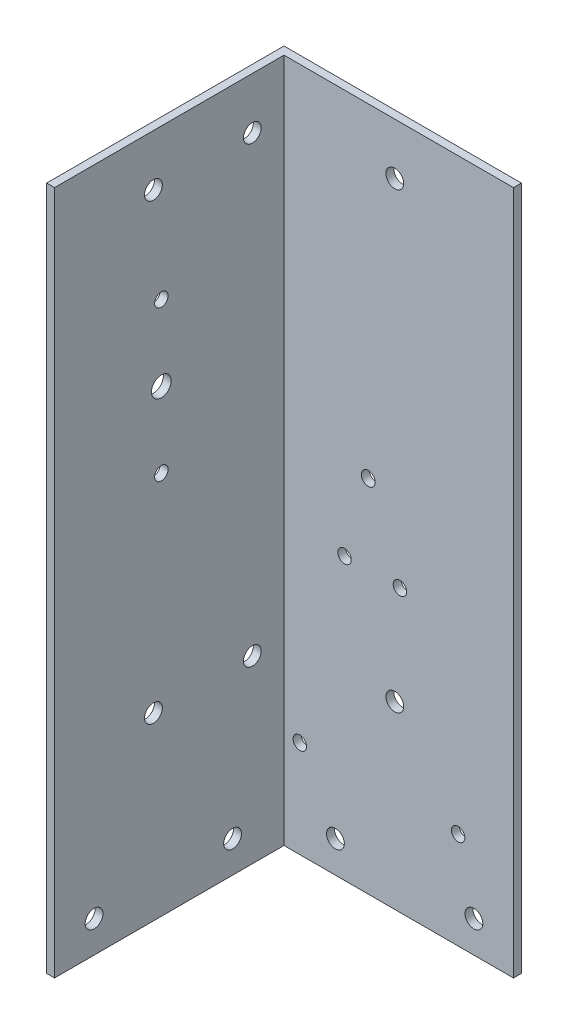
ISO-10303-21;
HEADER;
FILE_DESCRIPTION(('STEP AP214'),'2;1');
FILE_NAME('part.step','',(''),(''),'','','');
FILE_SCHEMA(('AUTOMOTIVE_DESIGN { 1 0 10303 214 1 1 1 1 }'));
ENDSEC;
DATA;
#1=APPLICATION_CONTEXT('core data for automotive mechanical design processes');
#2=APPLICATION_PROTOCOL_DEFINITION('international standard','automotive_design',2000,#1);
#3=PRODUCT_CONTEXT('',#1,'mechanical');
#4=PRODUCT('Part','Part','',(#3));
#5=PRODUCT_RELATED_PRODUCT_CATEGORY('part','',(#4));
#6=PRODUCT_DEFINITION_FORMATION('','',#4);
#7=PRODUCT_DEFINITION_CONTEXT('part definition',#1,'design');
#8=PRODUCT_DEFINITION('design','',#6,#7);
#9=PRODUCT_DEFINITION_SHAPE('','',#8);
#10=(LENGTH_UNIT() NAMED_UNIT(*) SI_UNIT(.MILLI.,.METRE.));
#11=(NAMED_UNIT(*) PLANE_ANGLE_UNIT() SI_UNIT($,.RADIAN.));
#12=(NAMED_UNIT(*) SI_UNIT($,.STERADIAN.) SOLID_ANGLE_UNIT());
#13=UNCERTAINTY_MEASURE_WITH_UNIT(LENGTH_MEASURE(1.E-05),#10,'distance_accuracy_value','');
#14=(GEOMETRIC_REPRESENTATION_CONTEXT(3) GLOBAL_UNCERTAINTY_ASSIGNED_CONTEXT((#13)) GLOBAL_UNIT_ASSIGNED_CONTEXT((#10,
#11,#12)) REPRESENTATION_CONTEXT('',''));
#15=CARTESIAN_POINT('',(0.,0.,0.));
#16=DIRECTION('',(0.,0.,1.));
#17=DIRECTION('',(1.,0.,0.));
#18=AXIS2_PLACEMENT_3D('',#15,#16,#17);
#19=CARTESIAN_POINT('',(0.,173.,1.99999999999997));
#20=DIRECTION('',(0.,0.,-1.));
#21=DIRECTION('',(-1.,0.,0.));
#22=AXIS2_PLACEMENT_3D('',#19,#20,#21);
#23=PLANE('',#22);
#24=CARTESIAN_POINT('',(23.2999996870757,91.0000000000002,1.99999999999989));
#25=DIRECTION('',(0.,0.,-1.));
#26=DIRECTION('',(-1.,0.,0.));
#27=AXIS2_PLACEMENT_3D('',#24,#25,#26);
#28=CIRCLE('',#27,1.75);
#29=CARTESIAN_POINT('',(21.5499996870757,91.0000000000002,1.99999999999989));
#30=VERTEX_POINT('',#29);
#31=EDGE_CURVE('E190',#30,#30,#28,.T.);
#32=ORIENTED_EDGE('',*,*,#31,.T.);
#33=EDGE_LOOP('',(#32));
#34=FACE_BOUND('',#33,.T.);
#35=CARTESIAN_POINT('',(46.,24.5,1.9999999999999));
#36=DIRECTION('',(0.,0.,-1.));
#37=DIRECTION('',(-1.,0.,0.));
#38=AXIS2_PLACEMENT_3D('',#35,#36,#37);
#39=CIRCLE('',#38,1.69999999999999);
#40=CARTESIAN_POINT('',(44.3,24.5,1.9999999999999));
#41=VERTEX_POINT('',#40);
#42=EDGE_CURVE('E194',#41,#41,#39,.T.);
#43=ORIENTED_EDGE('',*,*,#42,.T.);
#44=EDGE_LOOP('',(#43));
#45=FACE_BOUND('',#44,.T.);
#46=CARTESIAN_POINT('',(5.99999999999999,24.5,2.));
#47=DIRECTION('',(0.,0.,-1.));
#48=DIRECTION('',(-1.,0.,0.));
#49=AXIS2_PLACEMENT_3D('',#46,#47,#48);
#50=CIRCLE('',#49,1.69999999999999);
#51=CARTESIAN_POINT('',(4.3,24.5,2.));
#52=VERTEX_POINT('',#51);
#53=EDGE_CURVE('E198',#52,#52,#50,.T.);
#54=ORIENTED_EDGE('',*,*,#53,.T.);
#55=EDGE_LOOP('',(#54));
#56=FACE_BOUND('',#55,.T.);
#57=CARTESIAN_POINT('',(31.2999996870757,71.0000000000002,1.9999999999999));
#58=DIRECTION('',(0.,0.,-1.));
#59=DIRECTION('',(-1.,0.,0.));
#60=AXIS2_PLACEMENT_3D('',#57,#58,#59);
#61=CIRCLE('',#60,1.7);
#62=CARTESIAN_POINT('',(29.5999996870757,71.0000000000002,1.9999999999999));
#63=VERTEX_POINT('',#62);
#64=EDGE_CURVE('E202',#63,#63,#61,.T.);
#65=ORIENTED_EDGE('',*,*,#64,.T.);
#66=EDGE_LOOP('',(#65));
#67=FACE_BOUND('',#66,.T.);
#68=CARTESIAN_POINT('',(17.2999996870757,71.0000000000002,2.));
#69=DIRECTION('',(0.,0.,-1.));
#70=DIRECTION('',(-1.,0.,0.));
#71=AXIS2_PLACEMENT_3D('',#68,#69,#70);
#72=CIRCLE('',#71,1.7);
#73=CARTESIAN_POINT('',(15.5999996870757,71.0000000000002,2.));
#74=VERTEX_POINT('',#73);
#75=EDGE_CURVE('E206',#74,#74,#72,.T.);
#76=ORIENTED_EDGE('',*,*,#75,.T.);
#77=EDGE_LOOP('',(#76));
#78=FACE_BOUND('',#77,.T.);
#79=CARTESIAN_POINT('',(29.9999999999999,45.5,1.9999999999999));
#80=DIRECTION('',(0.,0.,-1.));
#81=DIRECTION('',(-1.,0.,0.));
#82=AXIS2_PLACEMENT_3D('',#79,#80,#81);
#83=CIRCLE('',#82,2.25);
#84=CARTESIAN_POINT('',(27.7499999999999,45.5,1.9999999999999));
#85=VERTEX_POINT('',#84);
#86=EDGE_CURVE('E210',#85,#85,#83,.T.);
#87=ORIENTED_EDGE('',*,*,#86,.T.);
#88=EDGE_LOOP('',(#87));
#89=FACE_BOUND('',#88,.T.);
#90=CARTESIAN_POINT('',(50.,8.00000000000002,1.9999999999999));
#91=DIRECTION('',(0.,0.,-1.));
#92=DIRECTION('',(-1.,0.,0.));
#93=AXIS2_PLACEMENT_3D('',#90,#91,#92);
#94=CIRCLE('',#93,2.25);
#95=CARTESIAN_POINT('',(47.75,8.00000000000002,1.9999999999999));
#96=VERTEX_POINT('',#95);
#97=EDGE_CURVE('E214',#96,#96,#94,.T.);
#98=ORIENTED_EDGE('',*,*,#97,.T.);
#99=EDGE_LOOP('',(#98));
#100=FACE_BOUND('',#99,.T.);
#101=CARTESIAN_POINT('',(15.,8.00000000000003,1.99999999999997));
#102=DIRECTION('',(0.,0.,-1.));
#103=DIRECTION('',(-1.,0.,0.));
#104=AXIS2_PLACEMENT_3D('',#101,#102,#103);
#105=CIRCLE('',#104,2.24999999999999);
#106=CARTESIAN_POINT('',(12.75,8.00000000000003,1.99999999999997));
#107=VERTEX_POINT('',#106);
#108=EDGE_CURVE('E218',#107,#107,#105,.T.);
#109=ORIENTED_EDGE('',*,*,#108,.T.);
#110=EDGE_LOOP('',(#109));
#111=FACE_BOUND('',#110,.T.);
#112=CARTESIAN_POINT('',(30.,160.,1.99999999999989));
#113=DIRECTION('',(0.,0.,-1.));
#114=DIRECTION('',(-1.,0.,0.));
#115=AXIS2_PLACEMENT_3D('',#112,#113,#114);
#116=CIRCLE('',#115,2.25);
#117=CARTESIAN_POINT('',(27.75,160.,1.99999999999989));
#118=VERTEX_POINT('',#117);
#119=EDGE_CURVE('E221',#118,#118,#116,.T.);
#120=ORIENTED_EDGE('',*,*,#119,.T.);
#121=EDGE_LOOP('',(#120));
#122=FACE_BOUND('',#121,.T.);
#123=DIRECTION('',(1.,0.,0.));
#124=VECTOR('',#123,1.);
#125=CARTESIAN_POINT('',(0.,0.,2.));
#126=LINE('',#125,#124);
#127=CARTESIAN_POINT('',(2.,0.,2.));
#128=VERTEX_POINT('',#127);
#129=CARTESIAN_POINT('',(60.,0.,1.9999999999999));
#130=VERTEX_POINT('',#129);
#131=EDGE_CURVE('E131',#128,#130,#126,.T.);
#132=ORIENTED_EDGE('',*,*,#131,.T.);
#133=DIRECTION('',(0.,-1.,0.));
#134=VECTOR('',#133,1.);
#135=CARTESIAN_POINT('',(60.,173.,1.9999999999999));
#136=LINE('',#135,#134);
#137=CARTESIAN_POINT('',(60.,173.,1.9999999999999));
#138=VERTEX_POINT('',#137);
#139=EDGE_CURVE('E11',#138,#130,#136,.T.);
#140=ORIENTED_EDGE('',*,*,#139,.F.);
#141=DIRECTION('',(1.,0.,0.));
#142=VECTOR('',#141,1.);
#143=CARTESIAN_POINT('',(0.,173.,1.99999999999997));
#144=LINE('',#143,#142);
#145=CARTESIAN_POINT('',(2.,173.,1.99999999999999));
#146=VERTEX_POINT('',#145);
#147=EDGE_CURVE('E91',#146,#138,#144,.T.);
#148=ORIENTED_EDGE('',*,*,#147,.F.);
#149=DIRECTION('',(0.,-1.,0.));
#150=VECTOR('',#149,1.);
#151=CARTESIAN_POINT('',(2.,173.,1.99999999999999));
#152=LINE('',#151,#150);
#153=EDGE_CURVE('E127',#146,#128,#152,.T.);
#154=ORIENTED_EDGE('',*,*,#153,.T.);
#155=EDGE_LOOP('',(#132,#140,#148,#154));
#156=FACE_BOUND('',#155,.T.);
#157=ADVANCED_FACE('F44',(#34,#45,#56,#67,#78,#89,#100,#111,#122,#156),#23,.F.);
#158=CARTESIAN_POINT('',(60.,173.,0.));
#159=DIRECTION('',(1.,0.,0.));
#160=DIRECTION('',(0.,0.,-1.));
#161=AXIS2_PLACEMENT_3D('',#158,#159,#160);
#162=PLANE('',#161);
#163=DIRECTION('',(0.,0.,1.));
#164=VECTOR('',#163,1.);
#165=CARTESIAN_POINT('',(60.,0.,0.));
#166=LINE('',#165,#164);
#167=CARTESIAN_POINT('',(60.,0.,0.));
#168=VERTEX_POINT('',#167);
#169=EDGE_CURVE('E135',#168,#130,#166,.T.);
#170=ORIENTED_EDGE('',*,*,#169,.F.);
#171=DIRECTION('',(0.,-1.,0.));
#172=VECTOR('',#171,1.);
#173=CARTESIAN_POINT('',(60.,173.,0.));
#174=LINE('',#173,#172);
#175=CARTESIAN_POINT('',(60.,173.,0.));
#176=VERTEX_POINT('',#175);
#177=EDGE_CURVE('E53',#176,#168,#174,.T.);
#178=ORIENTED_EDGE('',*,*,#177,.F.);
#179=DIRECTION('',(0.,0.,1.));
#180=VECTOR('',#179,1.);
#181=CARTESIAN_POINT('',(60.,173.,0.));
#182=LINE('',#181,#180);
#183=EDGE_CURVE('E281',#176,#138,#182,.T.);
#184=ORIENTED_EDGE('',*,*,#183,.T.);
#185=ORIENTED_EDGE('',*,*,#139,.T.);
#186=EDGE_LOOP('',(#170,#178,#184,#185));
#187=FACE_BOUND('',#186,.T.);
#188=ADVANCED_FACE('F164',(#187),#162,.T.);
#189=CARTESIAN_POINT('',(0.,173.,0.));
#190=DIRECTION('',(0.,0.,-1.));
#191=DIRECTION('',(-1.,0.,0.));
#192=AXIS2_PLACEMENT_3D('',#189,#190,#191);
#193=PLANE('',#192);
#194=CARTESIAN_POINT('',(23.2999996870757,91.0000000000002,0.));
#195=DIRECTION('',(0.,0.,-1.));
#196=DIRECTION('',(-1.,0.,0.));
#197=AXIS2_PLACEMENT_3D('',#194,#195,#196);
#198=CIRCLE('',#197,1.75);
#199=CARTESIAN_POINT('',(21.5499996870757,91.0000000000002,0.));
#200=VERTEX_POINT('',#199);
#201=EDGE_CURVE('E671',#200,#200,#198,.T.);
#202=ORIENTED_EDGE('',*,*,#201,.F.);
#203=EDGE_LOOP('',(#202));
#204=FACE_BOUND('',#203,.T.);
#205=CARTESIAN_POINT('',(46.,24.5,0.));
#206=DIRECTION('',(0.,0.,-1.));
#207=DIRECTION('',(-1.,0.,0.));
#208=AXIS2_PLACEMENT_3D('',#205,#206,#207);
#209=CIRCLE('',#208,1.69999999999999);
#210=CARTESIAN_POINT('',(44.3,24.5,0.));
#211=VERTEX_POINT('',#210);
#212=EDGE_CURVE('E676',#211,#211,#209,.T.);
#213=ORIENTED_EDGE('',*,*,#212,.F.);
#214=EDGE_LOOP('',(#213));
#215=FACE_BOUND('',#214,.T.);
#216=CARTESIAN_POINT('',(5.99999999999999,24.5,0.));
#217=DIRECTION('',(0.,0.,-1.));
#218=DIRECTION('',(-1.,0.,0.));
#219=AXIS2_PLACEMENT_3D('',#216,#217,#218);
#220=CIRCLE('',#219,1.69999999999999);
#221=CARTESIAN_POINT('',(4.3,24.5,0.));
#222=VERTEX_POINT('',#221);
#223=EDGE_CURVE('E684',#222,#222,#220,.T.);
#224=ORIENTED_EDGE('',*,*,#223,.F.);
#225=EDGE_LOOP('',(#224));
#226=FACE_BOUND('',#225,.T.);
#227=CARTESIAN_POINT('',(31.2999996870757,71.0000000000002,0.));
#228=DIRECTION('',(0.,0.,-1.));
#229=DIRECTION('',(-1.,0.,0.));
#230=AXIS2_PLACEMENT_3D('',#227,#228,#229);
#231=CIRCLE('',#230,1.7);
#232=CARTESIAN_POINT('',(29.5999996870757,71.0000000000002,0.));
#233=VERTEX_POINT('',#232);
#234=EDGE_CURVE('E690',#233,#233,#231,.T.);
#235=ORIENTED_EDGE('',*,*,#234,.F.);
#236=EDGE_LOOP('',(#235));
#237=FACE_BOUND('',#236,.T.);
#238=CARTESIAN_POINT('',(17.2999996870757,71.0000000000002,0.));
#239=DIRECTION('',(0.,0.,-1.));
#240=DIRECTION('',(-1.,0.,0.));
#241=AXIS2_PLACEMENT_3D('',#238,#239,#240);
#242=CIRCLE('',#241,1.7);
#243=CARTESIAN_POINT('',(15.5999996870757,71.0000000000002,0.));
#244=VERTEX_POINT('',#243);
#245=EDGE_CURVE('E696',#244,#244,#242,.T.);
#246=ORIENTED_EDGE('',*,*,#245,.F.);
#247=EDGE_LOOP('',(#246));
#248=FACE_BOUND('',#247,.T.);
#249=CARTESIAN_POINT('',(29.9999999999999,45.5,0.));
#250=DIRECTION('',(0.,0.,-1.));
#251=DIRECTION('',(-1.,0.,0.));
#252=AXIS2_PLACEMENT_3D('',#249,#250,#251);
#253=CIRCLE('',#252,2.24999999999999);
#254=CARTESIAN_POINT('',(27.75,45.5,0.));
#255=VERTEX_POINT('',#254);
#256=EDGE_CURVE('E719',#255,#255,#253,.T.);
#257=ORIENTED_EDGE('',*,*,#256,.F.);
#258=EDGE_LOOP('',(#257));
#259=FACE_BOUND('',#258,.T.);
#260=CARTESIAN_POINT('',(50.,8.00000000000002,0.));
#261=DIRECTION('',(0.,0.,-1.));
#262=DIRECTION('',(-1.,0.,0.));
#263=AXIS2_PLACEMENT_3D('',#260,#261,#262);
#264=CIRCLE('',#263,2.24999999999999);
#265=CARTESIAN_POINT('',(47.75,8.00000000000002,0.));
#266=VERTEX_POINT('',#265);
#267=EDGE_CURVE('E725',#266,#266,#264,.T.);
#268=ORIENTED_EDGE('',*,*,#267,.F.);
#269=EDGE_LOOP('',(#268));
#270=FACE_BOUND('',#269,.T.);
#271=CARTESIAN_POINT('',(15.,8.00000000000004,0.));
#272=DIRECTION('',(0.,0.,-1.));
#273=DIRECTION('',(-1.,0.,0.));
#274=AXIS2_PLACEMENT_3D('',#271,#272,#273);
#275=CIRCLE('',#274,2.24999999999999);
#276=CARTESIAN_POINT('',(12.75,8.00000000000004,0.));
#277=VERTEX_POINT('',#276);
#278=EDGE_CURVE('E731',#277,#277,#275,.T.);
#279=ORIENTED_EDGE('',*,*,#278,.F.);
#280=EDGE_LOOP('',(#279));
#281=FACE_BOUND('',#280,.T.);
#282=CARTESIAN_POINT('',(30.,160.,-1.11022302462516E-13));
#283=DIRECTION('',(0.,0.,-1.));
#284=DIRECTION('',(-1.,0.,0.));
#285=AXIS2_PLACEMENT_3D('',#282,#283,#284);
#286=CIRCLE('',#285,2.24999999999999);
#287=CARTESIAN_POINT('',(27.75,160.,-1.11022302462516E-13));
#288=VERTEX_POINT('',#287);
#289=EDGE_CURVE('E225',#288,#288,#286,.T.);
#290=ORIENTED_EDGE('',*,*,#289,.F.);
#291=EDGE_LOOP('',(#290));
#292=FACE_BOUND('',#291,.T.);
#293=DIRECTION('',(1.,0.,0.));
#294=VECTOR('',#293,1.);
#295=CARTESIAN_POINT('',(0.,0.,0.));
#296=LINE('',#295,#294);
#297=CARTESIAN_POINT('',(0.,0.,0.));
#298=VERTEX_POINT('',#297);
#299=EDGE_CURVE('E140',#298,#168,#296,.T.);
#300=ORIENTED_EDGE('',*,*,#299,.F.);
#301=DIRECTION('',(0.,-1.,0.));
#302=VECTOR('',#301,1.);
#303=CARTESIAN_POINT('',(0.,173.,0.));
#304=LINE('',#303,#302);
#305=CARTESIAN_POINT('',(0.,173.,0.));
#306=VERTEX_POINT('',#305);
#307=EDGE_CURVE('E113',#306,#298,#304,.T.);
#308=ORIENTED_EDGE('',*,*,#307,.F.);
#309=DIRECTION('',(1.,0.,0.));
#310=VECTOR('',#309,1.);
#311=CARTESIAN_POINT('',(0.,173.,0.));
#312=LINE('',#311,#310);
#313=EDGE_CURVE('E119',#306,#176,#312,.T.);
#314=ORIENTED_EDGE('',*,*,#313,.T.);
#315=ORIENTED_EDGE('',*,*,#177,.T.);
#316=EDGE_LOOP('',(#300,#308,#314,#315));
#317=FACE_BOUND('',#316,.T.);
#318=ADVANCED_FACE('F161',(#204,#215,#226,#237,#248,#259,#270,#281,#292,#317),#193,.T.);
#319=CARTESIAN_POINT('',(0.,173.,0.));
#320=DIRECTION('',(-1.,0.,0.));
#321=DIRECTION('',(0.,0.,1.));
#322=AXIS2_PLACEMENT_3D('',#319,#320,#321);
#323=PLANE('',#322);
#324=CARTESIAN_POINT('',(0.,116.,33.));
#325=DIRECTION('',(-1.,0.,0.));
#326=DIRECTION('',(0.,0.,1.));
#327=AXIS2_PLACEMENT_3D('',#324,#325,#326);
#328=CIRCLE('',#327,2.5);
#329=CARTESIAN_POINT('',(0.,116.,35.5));
#330=VERTEX_POINT('',#329);
#331=EDGE_CURVE('E327',#330,#330,#328,.T.);
#332=ORIENTED_EDGE('',*,*,#331,.F.);
#333=EDGE_LOOP('',(#332));
#334=FACE_BOUND('',#333,.T.);
#335=CARTESIAN_POINT('',(0.,97.,33.));
#336=DIRECTION('',(-1.,0.,0.));
#337=DIRECTION('',(0.,0.,1.));
#338=AXIS2_PLACEMENT_3D('',#335,#336,#337);
#339=CIRCLE('',#338,1.69999999999999);
#340=CARTESIAN_POINT('',(0.,97.,34.7));
#341=VERTEX_POINT('',#340);
#342=EDGE_CURVE('E331',#341,#341,#339,.T.);
#343=ORIENTED_EDGE('',*,*,#342,.F.);
#344=EDGE_LOOP('',(#343));
#345=FACE_BOUND('',#344,.T.);
#346=CARTESIAN_POINT('',(0.,135.,33.));
#347=DIRECTION('',(-1.,0.,0.));
#348=DIRECTION('',(0.,0.,1.));
#349=AXIS2_PLACEMENT_3D('',#346,#347,#348);
#350=CIRCLE('',#349,1.70000000000001);
#351=CARTESIAN_POINT('',(0.,135.,34.7));
#352=VERTEX_POINT('',#351);
#353=EDGE_CURVE('E335',#352,#352,#350,.T.);
#354=ORIENTED_EDGE('',*,*,#353,.F.);
#355=EDGE_LOOP('',(#354));
#356=FACE_BOUND('',#355,.T.);
#357=CARTESIAN_POINT('',(0.,45.5,35.));
#358=DIRECTION('',(-1.,0.,0.));
#359=DIRECTION('',(0.,0.,1.));
#360=AXIS2_PLACEMENT_3D('',#357,#358,#359);
#361=CIRCLE('',#360,2.25);
#362=CARTESIAN_POINT('',(0.,45.5,37.25));
#363=VERTEX_POINT('',#362);
#364=EDGE_CURVE('E224',#363,#363,#361,.T.);
#365=ORIENTED_EDGE('',*,*,#364,.F.);
#366=EDGE_LOOP('',(#365));
#367=FACE_BOUND('',#366,.T.);
#368=CARTESIAN_POINT('',(0.,45.5,9.99999999999999));
#369=DIRECTION('',(-1.,0.,0.));
#370=DIRECTION('',(0.,0.,1.));
#371=AXIS2_PLACEMENT_3D('',#368,#369,#370);
#372=CIRCLE('',#371,2.25);
#373=CARTESIAN_POINT('',(0.,45.5,12.25));
#374=VERTEX_POINT('',#373);
#375=EDGE_CURVE('E240',#374,#374,#372,.T.);
#376=ORIENTED_EDGE('',*,*,#375,.F.);
#377=EDGE_LOOP('',(#376));
#378=FACE_BOUND('',#377,.T.);
#379=CARTESIAN_POINT('',(0.,8.00000000000003,50.));
#380=DIRECTION('',(-1.,0.,0.));
#381=DIRECTION('',(0.,0.,1.));
#382=AXIS2_PLACEMENT_3D('',#379,#380,#381);
#383=CIRCLE('',#382,2.25);
#384=CARTESIAN_POINT('',(0.,8.00000000000003,52.25));
#385=VERTEX_POINT('',#384);
#386=EDGE_CURVE('E248',#385,#385,#383,.T.);
#387=ORIENTED_EDGE('',*,*,#386,.F.);
#388=EDGE_LOOP('',(#387));
#389=FACE_BOUND('',#388,.T.);
#390=CARTESIAN_POINT('',(0.,8.00000000000003,14.9999999999999));
#391=DIRECTION('',(-1.,0.,0.));
#392=DIRECTION('',(0.,0.,1.));
#393=AXIS2_PLACEMENT_3D('',#390,#391,#392);
#394=CIRCLE('',#393,2.25);
#395=CARTESIAN_POINT('',(0.,8.00000000000003,17.2499999999999));
#396=VERTEX_POINT('',#395);
#397=EDGE_CURVE('E256',#396,#396,#394,.T.);
#398=ORIENTED_EDGE('',*,*,#397,.F.);
#399=EDGE_LOOP('',(#398));
#400=FACE_BOUND('',#399,.T.);
#401=CARTESIAN_POINT('',(0.,160.,35.));
#402=DIRECTION('',(-1.,0.,0.));
#403=DIRECTION('',(0.,0.,1.));
#404=AXIS2_PLACEMENT_3D('',#401,#402,#403);
#405=CIRCLE('',#404,2.25);
#406=CARTESIAN_POINT('',(0.,160.,37.25));
#407=VERTEX_POINT('',#406);
#408=EDGE_CURVE('E264',#407,#407,#405,.T.);
#409=ORIENTED_EDGE('',*,*,#408,.F.);
#410=EDGE_LOOP('',(#409));
#411=FACE_BOUND('',#410,.T.);
#412=CARTESIAN_POINT('',(0.,160.,9.99999999999999));
#413=DIRECTION('',(-1.,0.,0.));
#414=DIRECTION('',(0.,0.,1.));
#415=AXIS2_PLACEMENT_3D('',#412,#413,#414);
#416=CIRCLE('',#415,2.25);
#417=CARTESIAN_POINT('',(0.,160.,12.25));
#418=VERTEX_POINT('',#417);
#419=EDGE_CURVE('E272',#418,#418,#416,.T.);
#420=ORIENTED_EDGE('',*,*,#419,.F.);
#421=EDGE_LOOP('',(#420));
#422=FACE_BOUND('',#421,.T.);
#423=DIRECTION('',(0.,0.,-1.));
#424=VECTOR('',#423,1.);
#425=CARTESIAN_POINT('',(0.,0.,0.));
#426=LINE('',#425,#424);
#427=CARTESIAN_POINT('',(0.,0.,60.));
#428=VERTEX_POINT('',#427);
#429=EDGE_CURVE('E107',#428,#298,#426,.T.);
#430=ORIENTED_EDGE('',*,*,#429,.F.);
#431=DIRECTION('',(0.,-1.,0.));
#432=VECTOR('',#431,1.);
#433=CARTESIAN_POINT('',(0.,173.,60.));
#434=LINE('',#433,#432);
#435=CARTESIAN_POINT('',(0.,173.,60.));
#436=VERTEX_POINT('',#435);
#437=EDGE_CURVE('E102',#436,#428,#434,.T.);
#438=ORIENTED_EDGE('',*,*,#437,.F.);
#439=DIRECTION('',(0.,0.,-1.));
#440=VECTOR('',#439,1.);
#441=CARTESIAN_POINT('',(0.,173.,0.));
#442=LINE('',#441,#440);
#443=EDGE_CURVE('E105',#436,#306,#442,.T.);
#444=ORIENTED_EDGE('',*,*,#443,.T.);
#445=ORIENTED_EDGE('',*,*,#307,.T.);
#446=EDGE_LOOP('',(#430,#438,#444,#445));
#447=FACE_BOUND('',#446,.T.);
#448=ADVANCED_FACE('F104',(#334,#345,#356,#367,#378,#389,#400,#411,#422,#447),#323,.T.);
#449=CARTESIAN_POINT('',(2.,173.,60.));
#450=DIRECTION('',(0.,0.,1.));
#451=DIRECTION('',(1.,0.,0.));
#452=AXIS2_PLACEMENT_3D('',#449,#450,#451);
#453=PLANE('',#452);
#454=DIRECTION('',(-1.,0.,0.));
#455=VECTOR('',#454,1.);
#456=CARTESIAN_POINT('',(2.,0.,60.));
#457=LINE('',#456,#455);
#458=CARTESIAN_POINT('',(2.,0.,60.));
#459=VERTEX_POINT('',#458);
#460=EDGE_CURVE('E146',#459,#428,#457,.T.);
#461=ORIENTED_EDGE('',*,*,#460,.F.);
#462=DIRECTION('',(0.,-1.,0.));
#463=VECTOR('',#462,1.);
#464=CARTESIAN_POINT('',(2.,173.,60.));
#465=LINE('',#464,#463);
#466=CARTESIAN_POINT('',(2.,173.,60.));
#467=VERTEX_POINT('',#466);
#468=EDGE_CURVE('E82',#467,#459,#465,.T.);
#469=ORIENTED_EDGE('',*,*,#468,.F.);
#470=DIRECTION('',(-1.,0.,0.));
#471=VECTOR('',#470,1.);
#472=CARTESIAN_POINT('',(2.,173.,60.));
#473=LINE('',#472,#471);
#474=EDGE_CURVE('E117',#467,#436,#473,.T.);
#475=ORIENTED_EDGE('',*,*,#474,.T.);
#476=ORIENTED_EDGE('',*,*,#437,.T.);
#477=EDGE_LOOP('',(#461,#469,#475,#476));
#478=FACE_BOUND('',#477,.T.);
#479=ADVANCED_FACE('F122',(#478),#453,.T.);
#480=CARTESIAN_POINT('',(2.,173.,0.));
#481=DIRECTION('',(-1.,0.,0.));
#482=DIRECTION('',(0.,0.,1.));
#483=AXIS2_PLACEMENT_3D('',#480,#481,#482);
#484=PLANE('',#483);
#485=CARTESIAN_POINT('',(2.,116.,33.));
#486=DIRECTION('',(-1.,0.,0.));
#487=DIRECTION('',(0.,0.,1.));
#488=AXIS2_PLACEMENT_3D('',#485,#486,#487);
#489=CIRCLE('',#488,2.5);
#490=CARTESIAN_POINT('',(2.,116.,35.5));
#491=VERTEX_POINT('',#490);
#492=EDGE_CURVE('E704',#491,#491,#489,.T.);
#493=ORIENTED_EDGE('',*,*,#492,.T.);
#494=EDGE_LOOP('',(#493));
#495=FACE_BOUND('',#494,.T.);
#496=CARTESIAN_POINT('',(2.,97.,33.));
#497=DIRECTION('',(-1.,0.,0.));
#498=DIRECTION('',(0.,0.,1.));
#499=AXIS2_PLACEMENT_3D('',#496,#497,#498);
#500=CIRCLE('',#499,1.69999999999999);
#501=CARTESIAN_POINT('',(2.,97.,34.7));
#502=VERTEX_POINT('',#501);
#503=EDGE_CURVE('E709',#502,#502,#500,.T.);
#504=ORIENTED_EDGE('',*,*,#503,.T.);
#505=EDGE_LOOP('',(#504));
#506=FACE_BOUND('',#505,.T.);
#507=CARTESIAN_POINT('',(2.,135.,33.));
#508=DIRECTION('',(-1.,0.,0.));
#509=DIRECTION('',(0.,0.,1.));
#510=AXIS2_PLACEMENT_3D('',#507,#508,#509);
#511=CIRCLE('',#510,1.70000000000001);
#512=CARTESIAN_POINT('',(2.,135.,34.7));
#513=VERTEX_POINT('',#512);
#514=EDGE_CURVE('E715',#513,#513,#511,.T.);
#515=ORIENTED_EDGE('',*,*,#514,.T.);
#516=EDGE_LOOP('',(#515));
#517=FACE_BOUND('',#516,.T.);
#518=CARTESIAN_POINT('',(2.,45.5,35.));
#519=DIRECTION('',(-1.,0.,0.));
#520=DIRECTION('',(0.,0.,1.));
#521=AXIS2_PLACEMENT_3D('',#518,#519,#520);
#522=CIRCLE('',#521,2.25);
#523=CARTESIAN_POINT('',(2.,45.5,37.25));
#524=VERTEX_POINT('',#523);
#525=EDGE_CURVE('E231',#524,#524,#522,.T.);
#526=ORIENTED_EDGE('',*,*,#525,.T.);
#527=EDGE_LOOP('',(#526));
#528=FACE_BOUND('',#527,.T.);
#529=CARTESIAN_POINT('',(2.,45.5,9.99999999999999));
#530=DIRECTION('',(-1.,0.,0.));
#531=DIRECTION('',(0.,0.,1.));
#532=AXIS2_PLACEMENT_3D('',#529,#530,#531);
#533=CIRCLE('',#532,2.25);
#534=CARTESIAN_POINT('',(2.,45.5,12.25));
#535=VERTEX_POINT('',#534);
#536=EDGE_CURVE('E244',#535,#535,#533,.T.);
#537=ORIENTED_EDGE('',*,*,#536,.T.);
#538=EDGE_LOOP('',(#537));
#539=FACE_BOUND('',#538,.T.);
#540=CARTESIAN_POINT('',(2.,8.00000000000003,50.));
#541=DIRECTION('',(-1.,0.,0.));
#542=DIRECTION('',(0.,0.,1.));
#543=AXIS2_PLACEMENT_3D('',#540,#541,#542);
#544=CIRCLE('',#543,2.25);
#545=CARTESIAN_POINT('',(2.,8.00000000000003,52.25));
#546=VERTEX_POINT('',#545);
#547=EDGE_CURVE('E252',#546,#546,#544,.T.);
#548=ORIENTED_EDGE('',*,*,#547,.T.);
#549=EDGE_LOOP('',(#548));
#550=FACE_BOUND('',#549,.T.);
#551=CARTESIAN_POINT('',(2.,8.00000000000003,14.9999999999999));
#552=DIRECTION('',(-1.,0.,0.));
#553=DIRECTION('',(0.,0.,1.));
#554=AXIS2_PLACEMENT_3D('',#551,#552,#553);
#555=CIRCLE('',#554,2.25);
#556=CARTESIAN_POINT('',(2.,8.00000000000003,17.2499999999999));
#557=VERTEX_POINT('',#556);
#558=EDGE_CURVE('E260',#557,#557,#555,.T.);
#559=ORIENTED_EDGE('',*,*,#558,.T.);
#560=EDGE_LOOP('',(#559));
#561=FACE_BOUND('',#560,.T.);
#562=CARTESIAN_POINT('',(2.,160.,35.));
#563=DIRECTION('',(-1.,0.,0.));
#564=DIRECTION('',(0.,0.,1.));
#565=AXIS2_PLACEMENT_3D('',#562,#563,#564);
#566=CIRCLE('',#565,2.25);
#567=CARTESIAN_POINT('',(2.,160.,37.25));
#568=VERTEX_POINT('',#567);
#569=EDGE_CURVE('E268',#568,#568,#566,.T.);
#570=ORIENTED_EDGE('',*,*,#569,.T.);
#571=EDGE_LOOP('',(#570));
#572=FACE_BOUND('',#571,.T.);
#573=CARTESIAN_POINT('',(2.,160.,9.99999999999999));
#574=DIRECTION('',(-1.,0.,0.));
#575=DIRECTION('',(0.,0.,1.));
#576=AXIS2_PLACEMENT_3D('',#573,#574,#575);
#577=CIRCLE('',#576,2.25);
#578=CARTESIAN_POINT('',(2.,160.,12.25));
#579=VERTEX_POINT('',#578);
#580=EDGE_CURVE('E136',#579,#579,#577,.T.);
#581=ORIENTED_EDGE('',*,*,#580,.T.);
#582=EDGE_LOOP('',(#581));
#583=FACE_BOUND('',#582,.T.);
#584=DIRECTION('',(0.,0.,-1.));
#585=VECTOR('',#584,1.);
#586=CARTESIAN_POINT('',(2.,0.,0.));
#587=LINE('',#586,#585);
#588=EDGE_CURVE('E85',#459,#128,#587,.T.);
#589=ORIENTED_EDGE('',*,*,#588,.T.);
#590=ORIENTED_EDGE('',*,*,#153,.F.);
#591=DIRECTION('',(0.,0.,-1.));
#592=VECTOR('',#591,1.);
#593=CARTESIAN_POINT('',(2.,173.,0.));
#594=LINE('',#593,#592);
#595=EDGE_CURVE('E61',#467,#146,#594,.T.);
#596=ORIENTED_EDGE('',*,*,#595,.F.);
#597=ORIENTED_EDGE('',*,*,#468,.T.);
#598=EDGE_LOOP('',(#589,#590,#596,#597));
#599=FACE_BOUND('',#598,.T.);
#600=ADVANCED_FACE('F169',(#495,#506,#517,#528,#539,#550,#561,#572,#583,#599),#484,.F.);
#601=CARTESIAN_POINT('',(0.,173.,0.));
#602=DIRECTION('',(0.,-1.,0.));
#603=DIRECTION('',(-1.,0.,0.));
#604=AXIS2_PLACEMENT_3D('',#601,#602,#603);
#605=PLANE('',#604);
#606=ORIENTED_EDGE('',*,*,#147,.T.);
#607=ORIENTED_EDGE('',*,*,#183,.F.);
#608=ORIENTED_EDGE('',*,*,#313,.F.);
#609=ORIENTED_EDGE('',*,*,#443,.F.);
#610=ORIENTED_EDGE('',*,*,#474,.F.);
#611=ORIENTED_EDGE('',*,*,#595,.T.);
#612=EDGE_LOOP('',(#606,#607,#608,#609,#610,#611));
#613=FACE_BOUND('',#612,.T.);
#614=ADVANCED_FACE('F116',(#613),#605,.F.);
#615=CARTESIAN_POINT('',(0.,0.,0.));
#616=DIRECTION('',(0.,-1.,0.));
#617=DIRECTION('',(-1.,0.,0.));
#618=AXIS2_PLACEMENT_3D('',#615,#616,#617);
#619=PLANE('',#618);
#620=ORIENTED_EDGE('',*,*,#131,.F.);
#621=ORIENTED_EDGE('',*,*,#588,.F.);
#622=ORIENTED_EDGE('',*,*,#460,.T.);
#623=ORIENTED_EDGE('',*,*,#429,.T.);
#624=ORIENTED_EDGE('',*,*,#299,.T.);
#625=ORIENTED_EDGE('',*,*,#169,.T.);
#626=EDGE_LOOP('',(#620,#621,#622,#623,#624,#625));
#627=FACE_BOUND('',#626,.T.);
#628=ADVANCED_FACE('F167',(#627),#619,.T.);
#629=CARTESIAN_POINT('',(0.,160.,9.99999999999999));
#630=DIRECTION('',(-1.,0.,0.));
#631=DIRECTION('',(0.,0.,1.));
#632=AXIS2_PLACEMENT_3D('',#629,#630,#631);
#633=CYLINDRICAL_SURFACE('',#632,2.25);
#634=ORIENTED_EDGE('',*,*,#580,.F.);
#635=EDGE_LOOP('',(#634));
#636=FACE_BOUND('',#635,.T.);
#637=ORIENTED_EDGE('',*,*,#419,.T.);
#638=EDGE_LOOP('',(#637));
#639=FACE_BOUND('',#638,.T.);
#640=ADVANCED_FACE('F309',(#636,#639),#633,.F.);
#641=CARTESIAN_POINT('',(0.,160.,35.));
#642=DIRECTION('',(-1.,0.,0.));
#643=DIRECTION('',(0.,0.,1.));
#644=AXIS2_PLACEMENT_3D('',#641,#642,#643);
#645=CYLINDRICAL_SURFACE('',#644,2.25);
#646=ORIENTED_EDGE('',*,*,#569,.F.);
#647=EDGE_LOOP('',(#646));
#648=FACE_BOUND('',#647,.T.);
#649=ORIENTED_EDGE('',*,*,#408,.T.);
#650=EDGE_LOOP('',(#649));
#651=FACE_BOUND('',#650,.T.);
#652=ADVANCED_FACE('F312',(#648,#651),#645,.F.);
#653=CARTESIAN_POINT('',(0.,8.00000000000003,14.9999999999999));
#654=DIRECTION('',(-1.,0.,0.));
#655=DIRECTION('',(0.,0.,1.));
#656=AXIS2_PLACEMENT_3D('',#653,#654,#655);
#657=CYLINDRICAL_SURFACE('',#656,2.25);
#658=ORIENTED_EDGE('',*,*,#558,.F.);
#659=EDGE_LOOP('',(#658));
#660=FACE_BOUND('',#659,.T.);
#661=ORIENTED_EDGE('',*,*,#397,.T.);
#662=EDGE_LOOP('',(#661));
#663=FACE_BOUND('',#662,.T.);
#664=ADVANCED_FACE('F347',(#660,#663),#657,.F.);
#665=CARTESIAN_POINT('',(0.,8.00000000000003,50.));
#666=DIRECTION('',(-1.,0.,0.));
#667=DIRECTION('',(0.,0.,1.));
#668=AXIS2_PLACEMENT_3D('',#665,#666,#667);
#669=CYLINDRICAL_SURFACE('',#668,2.25);
#670=ORIENTED_EDGE('',*,*,#547,.F.);
#671=EDGE_LOOP('',(#670));
#672=FACE_BOUND('',#671,.T.);
#673=ORIENTED_EDGE('',*,*,#386,.T.);
#674=EDGE_LOOP('',(#673));
#675=FACE_BOUND('',#674,.T.);
#676=ADVANCED_FACE('F353',(#672,#675),#669,.F.);
#677=CARTESIAN_POINT('',(0.,45.5,9.99999999999999));
#678=DIRECTION('',(-1.,0.,0.));
#679=DIRECTION('',(0.,0.,1.));
#680=AXIS2_PLACEMENT_3D('',#677,#678,#679);
#681=CYLINDRICAL_SURFACE('',#680,2.25);
#682=ORIENTED_EDGE('',*,*,#536,.F.);
#683=EDGE_LOOP('',(#682));
#684=FACE_BOUND('',#683,.T.);
#685=ORIENTED_EDGE('',*,*,#375,.T.);
#686=EDGE_LOOP('',(#685));
#687=FACE_BOUND('',#686,.T.);
#688=ADVANCED_FACE('F386',(#684,#687),#681,.F.);
#689=CARTESIAN_POINT('',(0.,45.5,35.));
#690=DIRECTION('',(-1.,0.,0.));
#691=DIRECTION('',(0.,0.,1.));
#692=AXIS2_PLACEMENT_3D('',#689,#690,#691);
#693=CYLINDRICAL_SURFACE('',#692,2.25);
#694=ORIENTED_EDGE('',*,*,#525,.F.);
#695=EDGE_LOOP('',(#694));
#696=FACE_BOUND('',#695,.T.);
#697=ORIENTED_EDGE('',*,*,#364,.T.);
#698=EDGE_LOOP('',(#697));
#699=FACE_BOUND('',#698,.T.);
#700=ADVANCED_FACE('F395',(#696,#699),#693,.F.);
#701=CARTESIAN_POINT('',(30.,160.,0.));
#702=DIRECTION('',(0.,0.,-1.));
#703=DIRECTION('',(-1.,0.,0.));
#704=AXIS2_PLACEMENT_3D('',#701,#702,#703);
#705=CYLINDRICAL_SURFACE('',#704,2.25);
#706=ORIENTED_EDGE('',*,*,#119,.F.);
#707=EDGE_LOOP('',(#706));
#708=FACE_BOUND('',#707,.T.);
#709=ORIENTED_EDGE('',*,*,#289,.T.);
#710=EDGE_LOOP('',(#709));
#711=FACE_BOUND('',#710,.T.);
#712=ADVANCED_FACE('F405',(#708,#711),#705,.F.);
#713=CARTESIAN_POINT('',(15.,8.00000000000004,0.));
#714=DIRECTION('',(0.,0.,-1.));
#715=DIRECTION('',(-1.,0.,0.));
#716=AXIS2_PLACEMENT_3D('',#713,#714,#715);
#717=CYLINDRICAL_SURFACE('',#716,2.24999999999999);
#718=ORIENTED_EDGE('',*,*,#108,.F.);
#719=EDGE_LOOP('',(#718));
#720=FACE_BOUND('',#719,.T.);
#721=ORIENTED_EDGE('',*,*,#278,.T.);
#722=EDGE_LOOP('',(#721));
#723=FACE_BOUND('',#722,.T.);
#724=ADVANCED_FACE('F415',(#720,#723),#717,.F.);
#725=CARTESIAN_POINT('',(50.,8.00000000000002,0.));
#726=DIRECTION('',(0.,0.,-1.));
#727=DIRECTION('',(-1.,0.,0.));
#728=AXIS2_PLACEMENT_3D('',#725,#726,#727);
#729=CYLINDRICAL_SURFACE('',#728,2.25);
#730=ORIENTED_EDGE('',*,*,#97,.F.);
#731=EDGE_LOOP('',(#730));
#732=FACE_BOUND('',#731,.T.);
#733=ORIENTED_EDGE('',*,*,#267,.T.);
#734=EDGE_LOOP('',(#733));
#735=FACE_BOUND('',#734,.T.);
#736=ADVANCED_FACE('F424',(#732,#735),#729,.F.);
#737=CARTESIAN_POINT('',(29.9999999999999,45.5,0.));
#738=DIRECTION('',(0.,0.,-1.));
#739=DIRECTION('',(-1.,0.,0.));
#740=AXIS2_PLACEMENT_3D('',#737,#738,#739);
#741=CYLINDRICAL_SURFACE('',#740,2.25);
#742=ORIENTED_EDGE('',*,*,#86,.F.);
#743=EDGE_LOOP('',(#742));
#744=FACE_BOUND('',#743,.T.);
#745=ORIENTED_EDGE('',*,*,#256,.T.);
#746=EDGE_LOOP('',(#745));
#747=FACE_BOUND('',#746,.T.);
#748=ADVANCED_FACE('F434',(#744,#747),#741,.F.);
#749=CARTESIAN_POINT('',(0.,135.,33.));
#750=DIRECTION('',(-1.,0.,0.));
#751=DIRECTION('',(0.,0.,1.));
#752=AXIS2_PLACEMENT_3D('',#749,#750,#751);
#753=CYLINDRICAL_SURFACE('',#752,1.70000000000001);
#754=ORIENTED_EDGE('',*,*,#514,.F.);
#755=EDGE_LOOP('',(#754));
#756=FACE_BOUND('',#755,.T.);
#757=ORIENTED_EDGE('',*,*,#353,.T.);
#758=EDGE_LOOP('',(#757));
#759=FACE_BOUND('',#758,.T.);
#760=ADVANCED_FACE('F444',(#756,#759),#753,.F.);
#761=CARTESIAN_POINT('',(0.,97.,33.));
#762=DIRECTION('',(-1.,0.,0.));
#763=DIRECTION('',(0.,0.,1.));
#764=AXIS2_PLACEMENT_3D('',#761,#762,#763);
#765=CYLINDRICAL_SURFACE('',#764,1.69999999999999);
#766=ORIENTED_EDGE('',*,*,#503,.F.);
#767=EDGE_LOOP('',(#766));
#768=FACE_BOUND('',#767,.T.);
#769=ORIENTED_EDGE('',*,*,#342,.T.);
#770=EDGE_LOOP('',(#769));
#771=FACE_BOUND('',#770,.T.);
#772=ADVANCED_FACE('F454',(#768,#771),#765,.F.);
#773=CARTESIAN_POINT('',(0.,116.,33.));
#774=DIRECTION('',(-1.,0.,0.));
#775=DIRECTION('',(0.,0.,1.));
#776=AXIS2_PLACEMENT_3D('',#773,#774,#775);
#777=CYLINDRICAL_SURFACE('',#776,2.5);
#778=ORIENTED_EDGE('',*,*,#492,.F.);
#779=EDGE_LOOP('',(#778));
#780=FACE_BOUND('',#779,.T.);
#781=ORIENTED_EDGE('',*,*,#331,.T.);
#782=EDGE_LOOP('',(#781));
#783=FACE_BOUND('',#782,.T.);
#784=ADVANCED_FACE('F464',(#780,#783),#777,.F.);
#785=CARTESIAN_POINT('',(17.2999996870757,71.0000000000002,0.));
#786=DIRECTION('',(0.,0.,-1.));
#787=DIRECTION('',(-1.,0.,0.));
#788=AXIS2_PLACEMENT_3D('',#785,#786,#787);
#789=CYLINDRICAL_SURFACE('',#788,1.7);
#790=ORIENTED_EDGE('',*,*,#75,.F.);
#791=EDGE_LOOP('',(#790));
#792=FACE_BOUND('',#791,.T.);
#793=ORIENTED_EDGE('',*,*,#245,.T.);
#794=EDGE_LOOP('',(#793));
#795=FACE_BOUND('',#794,.T.);
#796=ADVANCED_FACE('F474',(#792,#795),#789,.F.);
#797=CARTESIAN_POINT('',(31.2999996870757,71.0000000000002,0.));
#798=DIRECTION('',(0.,0.,-1.));
#799=DIRECTION('',(-1.,0.,0.));
#800=AXIS2_PLACEMENT_3D('',#797,#798,#799);
#801=CYLINDRICAL_SURFACE('',#800,1.7);
#802=ORIENTED_EDGE('',*,*,#64,.F.);
#803=EDGE_LOOP('',(#802));
#804=FACE_BOUND('',#803,.T.);
#805=ORIENTED_EDGE('',*,*,#234,.T.);
#806=EDGE_LOOP('',(#805));
#807=FACE_BOUND('',#806,.T.);
#808=ADVANCED_FACE('F484',(#804,#807),#801,.F.);
#809=CARTESIAN_POINT('',(5.99999999999999,24.5,0.));
#810=DIRECTION('',(0.,0.,-1.));
#811=DIRECTION('',(-1.,0.,0.));
#812=AXIS2_PLACEMENT_3D('',#809,#810,#811);
#813=CYLINDRICAL_SURFACE('',#812,1.69999999999999);
#814=ORIENTED_EDGE('',*,*,#53,.F.);
#815=EDGE_LOOP('',(#814));
#816=FACE_BOUND('',#815,.T.);
#817=ORIENTED_EDGE('',*,*,#223,.T.);
#818=EDGE_LOOP('',(#817));
#819=FACE_BOUND('',#818,.T.);
#820=ADVANCED_FACE('F494',(#816,#819),#813,.F.);
#821=CARTESIAN_POINT('',(46.,24.5,0.));
#822=DIRECTION('',(0.,0.,-1.));
#823=DIRECTION('',(-1.,0.,0.));
#824=AXIS2_PLACEMENT_3D('',#821,#822,#823);
#825=CYLINDRICAL_SURFACE('',#824,1.69999999999999);
#826=ORIENTED_EDGE('',*,*,#42,.F.);
#827=EDGE_LOOP('',(#826));
#828=FACE_BOUND('',#827,.T.);
#829=ORIENTED_EDGE('',*,*,#212,.T.);
#830=EDGE_LOOP('',(#829));
#831=FACE_BOUND('',#830,.T.);
#832=ADVANCED_FACE('F504',(#828,#831),#825,.F.);
#833=CARTESIAN_POINT('',(23.2999996870757,91.0000000000002,0.));
#834=DIRECTION('',(0.,0.,-1.));
#835=DIRECTION('',(-1.,0.,0.));
#836=AXIS2_PLACEMENT_3D('',#833,#834,#835);
#837=CYLINDRICAL_SURFACE('',#836,1.75);
#838=ORIENTED_EDGE('',*,*,#31,.F.);
#839=EDGE_LOOP('',(#838));
#840=FACE_BOUND('',#839,.T.);
#841=ORIENTED_EDGE('',*,*,#201,.T.);
#842=EDGE_LOOP('',(#841));
#843=FACE_BOUND('',#842,.T.);
#844=ADVANCED_FACE('F514',(#840,#843),#837,.F.);
#845=CLOSED_SHELL('',(#157,#188,#318,#448,#479,#600,#614,#628,#640,#652,#664,#676,#688,#700,
#712,#724,#736,#748,#760,#772,#784,#796,#808,#820,#832,#844));
#846=MANIFOLD_SOLID_BREP('B2',#845);
#847=ADVANCED_BREP_SHAPE_REPRESENTATION('',(#18,#846),#14);
#848=SHAPE_DEFINITION_REPRESENTATION(#9,#847);
ENDSEC;
END-ISO-10303-21;
